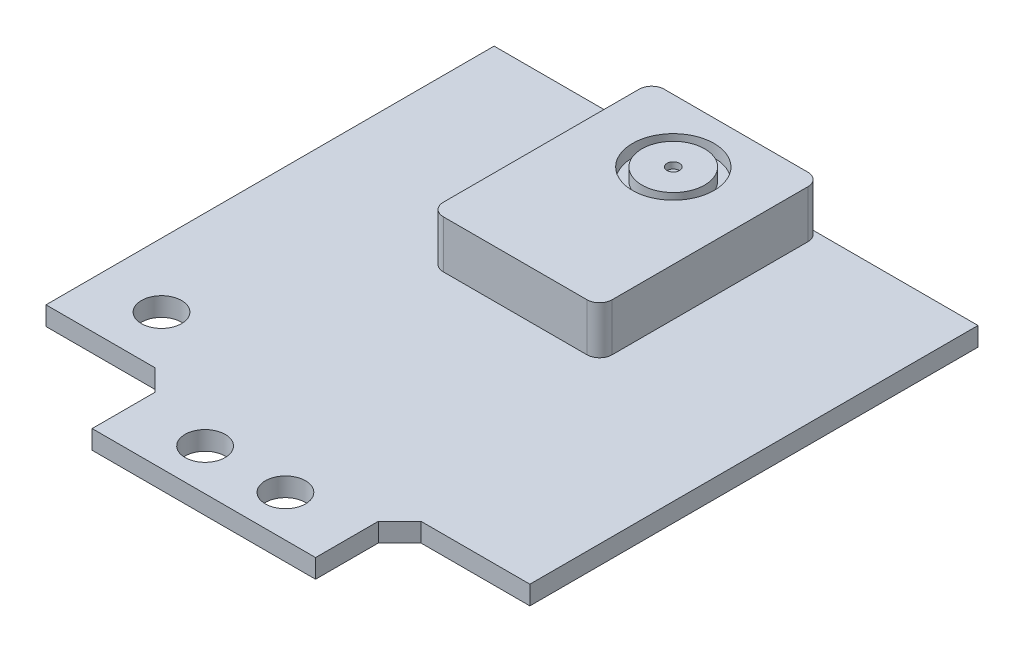
ISO-10303-21;
HEADER;
FILE_DESCRIPTION(('STEP AP214'),'2;1');
FILE_NAME('part.step','',(''),(''),'','','');
FILE_SCHEMA(('AUTOMOTIVE_DESIGN { 1 0 10303 214 1 1 1 1 }'));
ENDSEC;
DATA;
#1=APPLICATION_CONTEXT('core data for automotive mechanical design processes');
#2=APPLICATION_PROTOCOL_DEFINITION('international standard','automotive_design',2000,#1);
#3=PRODUCT_CONTEXT('',#1,'mechanical');
#4=PRODUCT('Part','Part','',(#3));
#5=PRODUCT_RELATED_PRODUCT_CATEGORY('part','',(#4));
#6=PRODUCT_DEFINITION_FORMATION('','',#4);
#7=PRODUCT_DEFINITION_CONTEXT('part definition',#1,'design');
#8=PRODUCT_DEFINITION('design','',#6,#7);
#9=PRODUCT_DEFINITION_SHAPE('','',#8);
#10=(LENGTH_UNIT() NAMED_UNIT(*) SI_UNIT(.MILLI.,.METRE.));
#11=(NAMED_UNIT(*) PLANE_ANGLE_UNIT() SI_UNIT($,.RADIAN.));
#12=(NAMED_UNIT(*) SI_UNIT($,.STERADIAN.) SOLID_ANGLE_UNIT());
#13=UNCERTAINTY_MEASURE_WITH_UNIT(LENGTH_MEASURE(1.E-05),#10,'distance_accuracy_value','');
#14=(GEOMETRIC_REPRESENTATION_CONTEXT(3) GLOBAL_UNCERTAINTY_ASSIGNED_CONTEXT((#13)) GLOBAL_UNIT_ASSIGNED_CONTEXT((#10,
#11,#12)) REPRESENTATION_CONTEXT('',''));
#15=CARTESIAN_POINT('',(0.,0.,0.));
#16=DIRECTION('',(0.,0.,1.));
#17=DIRECTION('',(1.,0.,0.));
#18=AXIS2_PLACEMENT_3D('',#15,#16,#17);
#19=CARTESIAN_POINT('',(6.725,5.3,0.));
#20=DIRECTION('',(-1.,0.,0.));
#21=DIRECTION('',(0.,0.,1.));
#22=AXIS2_PLACEMENT_3D('',#19,#20,#21);
#23=PLANE('',#22);
#24=DIRECTION('',(0.,0.,-1.));
#25=VECTOR('',#24,1.);
#26=CARTESIAN_POINT('',(6.725,1.5,0.));
#27=LINE('',#26,#25);
#28=CARTESIAN_POINT('',(6.725,1.5,-1.25));
#29=VERTEX_POINT('',#28);
#30=CARTESIAN_POINT('',(6.725,1.5,-16.85));
#31=VERTEX_POINT('',#30);
#32=EDGE_CURVE('E246',#29,#31,#27,.T.);
#33=ORIENTED_EDGE('',*,*,#32,.T.);
#34=DIRECTION('',(0.,-1.,0.));
#35=VECTOR('',#34,1.);
#36=CARTESIAN_POINT('',(6.725,5.3,-16.85));
#37=LINE('',#36,#35);
#38=CARTESIAN_POINT('',(6.725,5.3,-16.85));
#39=VERTEX_POINT('',#38);
#40=EDGE_CURVE('E13',#39,#31,#37,.T.);
#41=ORIENTED_EDGE('',*,*,#40,.F.);
#42=DIRECTION('',(0.,0.,-1.));
#43=VECTOR('',#42,1.);
#44=CARTESIAN_POINT('',(6.725,5.3,0.));
#45=LINE('',#44,#43);
#46=CARTESIAN_POINT('',(6.725,5.3,-1.25));
#47=VERTEX_POINT('',#46);
#48=EDGE_CURVE('E204',#47,#39,#45,.T.);
#49=ORIENTED_EDGE('',*,*,#48,.F.);
#50=DIRECTION('',(0.,-1.,0.));
#51=VECTOR('',#50,1.);
#52=CARTESIAN_POINT('',(6.725,5.3,-1.25));
#53=LINE('',#52,#51);
#54=EDGE_CURVE('E167',#47,#29,#53,.T.);
#55=ORIENTED_EDGE('',*,*,#54,.T.);
#56=EDGE_LOOP('',(#33,#41,#49,#55));
#57=FACE_BOUND('',#56,.T.);
#58=ADVANCED_FACE('F151',(#57),#23,.F.);
#59=CARTESIAN_POINT('',(5.725,5.3,-16.85));
#60=DIRECTION('',(0.,-1.,0.));
#61=DIRECTION('',(0.,0.,-1.));
#62=AXIS2_PLACEMENT_3D('',#59,#60,#61);
#63=CYLINDRICAL_SURFACE('',#62,1.);
#64=CARTESIAN_POINT('',(5.725,1.5,-16.85));
#65=DIRECTION('',(0.,-1.,0.));
#66=DIRECTION('',(0.,0.,-1.));
#67=AXIS2_PLACEMENT_3D('',#64,#65,#66);
#68=CIRCLE('',#67,1.);
#69=CARTESIAN_POINT('',(5.725,1.5,-17.85));
#70=VERTEX_POINT('',#69);
#71=EDGE_CURVE('E248',#70,#31,#68,.T.);
#72=ORIENTED_EDGE('',*,*,#71,.F.);
#73=DIRECTION('',(0.,-1.,0.));
#74=VECTOR('',#73,1.);
#75=CARTESIAN_POINT('',(5.725,5.3,-17.85));
#76=LINE('',#75,#74);
#77=CARTESIAN_POINT('',(5.725,5.3,-17.85));
#78=VERTEX_POINT('',#77);
#79=EDGE_CURVE('E159',#78,#70,#76,.T.);
#80=ORIENTED_EDGE('',*,*,#79,.F.);
#81=CARTESIAN_POINT('',(5.725,5.3,-16.85));
#82=DIRECTION('',(0.,-1.,0.));
#83=DIRECTION('',(0.,0.,-1.));
#84=AXIS2_PLACEMENT_3D('',#81,#82,#83);
#85=CIRCLE('',#84,1.);
#86=EDGE_CURVE('E286',#78,#39,#85,.T.);
#87=ORIENTED_EDGE('',*,*,#86,.T.);
#88=ORIENTED_EDGE('',*,*,#40,.T.);
#89=EDGE_LOOP('',(#72,#80,#87,#88));
#90=FACE_BOUND('',#89,.T.);
#91=ADVANCED_FACE('F285',(#90),#63,.T.);
#92=CARTESIAN_POINT('',(0.,5.3,-17.85));
#93=DIRECTION('',(0.,0.,1.));
#94=DIRECTION('',(1.,0.,0.));
#95=AXIS2_PLACEMENT_3D('',#92,#93,#94);
#96=PLANE('',#95);
#97=DIRECTION('',(-1.,0.,0.));
#98=VECTOR('',#97,1.);
#99=CARTESIAN_POINT('',(0.,1.5,-17.85));
#100=LINE('',#99,#98);
#101=CARTESIAN_POINT('',(-5.725,1.5,-17.85));
#102=VERTEX_POINT('',#101);
#103=EDGE_CURVE('E252',#70,#102,#100,.T.);
#104=ORIENTED_EDGE('',*,*,#103,.T.);
#105=DIRECTION('',(0.,-1.,0.));
#106=VECTOR('',#105,1.);
#107=CARTESIAN_POINT('',(-5.725,5.3,-17.85));
#108=LINE('',#107,#106);
#109=CARTESIAN_POINT('',(-5.725,5.3,-17.85));
#110=VERTEX_POINT('',#109);
#111=EDGE_CURVE('E272',#110,#102,#108,.T.);
#112=ORIENTED_EDGE('',*,*,#111,.F.);
#113=DIRECTION('',(-1.,0.,0.));
#114=VECTOR('',#113,1.);
#115=CARTESIAN_POINT('',(0.,5.3,-17.85));
#116=LINE('',#115,#114);
#117=EDGE_CURVE('E278',#78,#110,#116,.T.);
#118=ORIENTED_EDGE('',*,*,#117,.F.);
#119=ORIENTED_EDGE('',*,*,#79,.T.);
#120=EDGE_LOOP('',(#104,#112,#118,#119));
#121=FACE_BOUND('',#120,.T.);
#122=ADVANCED_FACE('F276',(#121),#96,.F.);
#123=CARTESIAN_POINT('',(-5.725,5.3,-16.85));
#124=DIRECTION('',(0.,-1.,0.));
#125=DIRECTION('',(0.,0.,-1.));
#126=AXIS2_PLACEMENT_3D('',#123,#124,#125);
#127=CYLINDRICAL_SURFACE('',#126,1.);
#128=CARTESIAN_POINT('',(-5.725,1.5,-16.85));
#129=DIRECTION('',(0.,-1.,0.));
#130=DIRECTION('',(0.,0.,-1.));
#131=AXIS2_PLACEMENT_3D('',#128,#129,#130);
#132=CIRCLE('',#131,1.);
#133=CARTESIAN_POINT('',(-6.725,1.5,-16.85));
#134=VERTEX_POINT('',#133);
#135=EDGE_CURVE('E255',#134,#102,#132,.T.);
#136=ORIENTED_EDGE('',*,*,#135,.F.);
#137=DIRECTION('',(0.,-1.,0.));
#138=VECTOR('',#137,1.);
#139=CARTESIAN_POINT('',(-6.725,5.3,-16.85));
#140=LINE('',#139,#138);
#141=CARTESIAN_POINT('',(-6.725,5.3,-16.85));
#142=VERTEX_POINT('',#141);
#143=EDGE_CURVE('E270',#142,#134,#140,.T.);
#144=ORIENTED_EDGE('',*,*,#143,.F.);
#145=CARTESIAN_POINT('',(-5.725,5.3,-16.85));
#146=DIRECTION('',(0.,-1.,0.));
#147=DIRECTION('',(0.,0.,-1.));
#148=AXIS2_PLACEMENT_3D('',#145,#146,#147);
#149=CIRCLE('',#148,1.);
#150=EDGE_CURVE('E429',#142,#110,#149,.T.);
#151=ORIENTED_EDGE('',*,*,#150,.T.);
#152=ORIENTED_EDGE('',*,*,#111,.T.);
#153=EDGE_LOOP('',(#136,#144,#151,#152));
#154=FACE_BOUND('',#153,.T.);
#155=ADVANCED_FACE('F306',(#154),#127,.T.);
#156=CARTESIAN_POINT('',(-6.725,5.3,0.));
#157=DIRECTION('',(-1.,0.,0.));
#158=DIRECTION('',(0.,0.,1.));
#159=AXIS2_PLACEMENT_3D('',#156,#157,#158);
#160=PLANE('',#159);
#161=DIRECTION('',(0.,0.,-1.));
#162=VECTOR('',#161,1.);
#163=CARTESIAN_POINT('',(-6.725,1.5,0.));
#164=LINE('',#163,#162);
#165=CARTESIAN_POINT('',(-6.725,1.5,-1.25));
#166=VERTEX_POINT('',#165);
#167=EDGE_CURVE('E258',#166,#134,#164,.T.);
#168=ORIENTED_EDGE('',*,*,#167,.F.);
#169=DIRECTION('',(0.,-1.,0.));
#170=VECTOR('',#169,1.);
#171=CARTESIAN_POINT('',(-6.725,5.3,-1.25));
#172=LINE('',#171,#170);
#173=CARTESIAN_POINT('',(-6.725,5.3,-1.25));
#174=VERTEX_POINT('',#173);
#175=EDGE_CURVE('E230',#174,#166,#172,.T.);
#176=ORIENTED_EDGE('',*,*,#175,.F.);
#177=DIRECTION('',(0.,0.,-1.));
#178=VECTOR('',#177,1.);
#179=CARTESIAN_POINT('',(-6.725,5.3,0.));
#180=LINE('',#179,#178);
#181=EDGE_CURVE('E238',#174,#142,#180,.T.);
#182=ORIENTED_EDGE('',*,*,#181,.T.);
#183=ORIENTED_EDGE('',*,*,#143,.T.);
#184=EDGE_LOOP('',(#168,#176,#182,#183));
#185=FACE_BOUND('',#184,.T.);
#186=ADVANCED_FACE('F311',(#185),#160,.T.);
#187=CARTESIAN_POINT('',(-5.725,5.3,-1.25));
#188=DIRECTION('',(0.,-1.,0.));
#189=DIRECTION('',(0.,0.,-1.));
#190=AXIS2_PLACEMENT_3D('',#187,#188,#189);
#191=CYLINDRICAL_SURFACE('',#190,1.);
#192=CARTESIAN_POINT('',(-5.725,1.5,-1.25));
#193=DIRECTION('',(0.,-1.,0.));
#194=DIRECTION('',(0.,0.,-1.));
#195=AXIS2_PLACEMENT_3D('',#192,#193,#194);
#196=CIRCLE('',#195,1.);
#197=CARTESIAN_POINT('',(-5.725,1.5,-0.249999999999999));
#198=VERTEX_POINT('',#197);
#199=EDGE_CURVE('E226',#198,#166,#196,.T.);
#200=ORIENTED_EDGE('',*,*,#199,.F.);
#201=DIRECTION('',(0.,-1.,0.));
#202=VECTOR('',#201,1.);
#203=CARTESIAN_POINT('',(-5.725,5.3,-0.249999999999999));
#204=LINE('',#203,#202);
#205=CARTESIAN_POINT('',(-5.725,5.3,-0.249999999999999));
#206=VERTEX_POINT('',#205);
#207=EDGE_CURVE('E221',#206,#198,#204,.T.);
#208=ORIENTED_EDGE('',*,*,#207,.F.);
#209=CARTESIAN_POINT('',(-5.725,5.3,-1.25));
#210=DIRECTION('',(0.,-1.,0.));
#211=DIRECTION('',(0.,0.,-1.));
#212=AXIS2_PLACEMENT_3D('',#209,#210,#211);
#213=CIRCLE('',#212,1.);
#214=EDGE_CURVE('E224',#206,#174,#213,.T.);
#215=ORIENTED_EDGE('',*,*,#214,.T.);
#216=ORIENTED_EDGE('',*,*,#175,.T.);
#217=EDGE_LOOP('',(#200,#208,#215,#216));
#218=FACE_BOUND('',#217,.T.);
#219=ADVANCED_FACE('F223',(#218),#191,.T.);
#220=CARTESIAN_POINT('',(0.,5.3,-0.249999999999999));
#221=DIRECTION('',(0.,0.,1.));
#222=DIRECTION('',(1.,0.,0.));
#223=AXIS2_PLACEMENT_3D('',#220,#221,#222);
#224=PLANE('',#223);
#225=DIRECTION('',(-1.,0.,0.));
#226=VECTOR('',#225,1.);
#227=CARTESIAN_POINT('',(0.,1.5,-0.249999999999999));
#228=LINE('',#227,#226);
#229=CARTESIAN_POINT('',(5.725,1.5,-0.25));
#230=VERTEX_POINT('',#229);
#231=EDGE_CURVE('E262',#230,#198,#228,.T.);
#232=ORIENTED_EDGE('',*,*,#231,.F.);
#233=DIRECTION('',(0.,-1.,0.));
#234=VECTOR('',#233,1.);
#235=CARTESIAN_POINT('',(5.725,5.3,-0.25));
#236=LINE('',#235,#234);
#237=CARTESIAN_POINT('',(5.725,5.3,-0.25));
#238=VERTEX_POINT('',#237);
#239=EDGE_CURVE('E192',#238,#230,#236,.T.);
#240=ORIENTED_EDGE('',*,*,#239,.F.);
#241=DIRECTION('',(-1.,0.,0.));
#242=VECTOR('',#241,1.);
#243=CARTESIAN_POINT('',(0.,5.3,-0.249999999999999));
#244=LINE('',#243,#242);
#245=EDGE_CURVE('E235',#238,#206,#244,.T.);
#246=ORIENTED_EDGE('',*,*,#245,.T.);
#247=ORIENTED_EDGE('',*,*,#207,.T.);
#248=EDGE_LOOP('',(#232,#240,#246,#247));
#249=FACE_BOUND('',#248,.T.);
#250=ADVANCED_FACE('F240',(#249),#224,.T.);
#251=CARTESIAN_POINT('',(5.725,5.3,-1.25));
#252=DIRECTION('',(0.,-1.,0.));
#253=DIRECTION('',(0.,0.,-1.));
#254=AXIS2_PLACEMENT_3D('',#251,#252,#253);
#255=CYLINDRICAL_SURFACE('',#254,1.);
#256=CARTESIAN_POINT('',(5.725,1.5,-1.25));
#257=DIRECTION('',(0.,-1.,0.));
#258=DIRECTION('',(0.,0.,-1.));
#259=AXIS2_PLACEMENT_3D('',#256,#257,#258);
#260=CIRCLE('',#259,1.);
#261=EDGE_CURVE('E264',#29,#230,#260,.T.);
#262=ORIENTED_EDGE('',*,*,#261,.F.);
#263=ORIENTED_EDGE('',*,*,#54,.F.);
#264=CARTESIAN_POINT('',(5.725,5.3,-1.25));
#265=DIRECTION('',(0.,-1.,0.));
#266=DIRECTION('',(0.,0.,-1.));
#267=AXIS2_PLACEMENT_3D('',#264,#265,#266);
#268=CIRCLE('',#267,1.);
#269=EDGE_CURVE('E241',#47,#238,#268,.T.);
#270=ORIENTED_EDGE('',*,*,#269,.T.);
#271=ORIENTED_EDGE('',*,*,#239,.T.);
#272=EDGE_LOOP('',(#262,#263,#270,#271));
#273=FACE_BOUND('',#272,.T.);
#274=ADVANCED_FACE('F287',(#273),#255,.T.);
#275=CARTESIAN_POINT('',(5.725,5.3,-16.85));
#276=DIRECTION('',(0.,-1.,0.));
#277=DIRECTION('',(0.,0.,-1.));
#278=AXIS2_PLACEMENT_3D('',#275,#276,#277);
#279=PLANE('',#278);
#280=CARTESIAN_POINT('',(0.,5.3,-12.85));
#281=DIRECTION('',(0.,-1.,0.));
#282=DIRECTION('',(0.,0.,-1.));
#283=AXIS2_PLACEMENT_3D('',#280,#281,#282);
#284=CIRCLE('',#283,3.25);
#285=CARTESIAN_POINT('',(0.,5.3,-16.1));
#286=VERTEX_POINT('',#285);
#287=EDGE_CURVE('E420',#286,#286,#284,.T.);
#288=ORIENTED_EDGE('',*,*,#287,.T.);
#289=EDGE_LOOP('',(#288));
#290=FACE_BOUND('',#289,.T.);
#291=ORIENTED_EDGE('',*,*,#48,.T.);
#292=ORIENTED_EDGE('',*,*,#86,.F.);
#293=ORIENTED_EDGE('',*,*,#117,.T.);
#294=ORIENTED_EDGE('',*,*,#150,.F.);
#295=ORIENTED_EDGE('',*,*,#181,.F.);
#296=ORIENTED_EDGE('',*,*,#214,.F.);
#297=ORIENTED_EDGE('',*,*,#245,.F.);
#298=ORIENTED_EDGE('',*,*,#269,.F.);
#299=EDGE_LOOP('',(#291,#292,#293,#294,#295,#296,#297,#298));
#300=FACE_BOUND('',#299,.T.);
#301=ADVANCED_FACE('F234',(#290,#300),#279,.F.);
#302=CARTESIAN_POINT('',(5.725,1.5,-16.85));
#303=DIRECTION('',(0.,-1.,0.));
#304=DIRECTION('',(0.,0.,-1.));
#305=AXIS2_PLACEMENT_3D('',#302,#303,#304);
#306=PLANE('',#305);
#307=ORIENTED_EDGE('',*,*,#32,.F.);
#308=ORIENTED_EDGE('',*,*,#261,.T.);
#309=ORIENTED_EDGE('',*,*,#231,.T.);
#310=ORIENTED_EDGE('',*,*,#199,.T.);
#311=ORIENTED_EDGE('',*,*,#167,.T.);
#312=ORIENTED_EDGE('',*,*,#135,.T.);
#313=ORIENTED_EDGE('',*,*,#103,.F.);
#314=ORIENTED_EDGE('',*,*,#71,.T.);
#315=EDGE_LOOP('',(#307,#308,#309,#310,#311,#312,#313,#314));
#316=FACE_BOUND('',#315,.T.);
#317=ADVANCED_FACE('F283',(#316),#306,.T.);
#318=CARTESIAN_POINT('',(0.,4.3,-12.85));
#319=DIRECTION('',(0.,-1.,0.));
#320=DIRECTION('',(0.,0.,-1.));
#321=AXIS2_PLACEMENT_3D('',#318,#319,#320);
#322=PLANE('',#321);
#323=CARTESIAN_POINT('',(0.,4.3,-12.85));
#324=DIRECTION('',(0.,-1.,0.));
#325=DIRECTION('',(0.,0.,-1.));
#326=AXIS2_PLACEMENT_3D('',#323,#324,#325);
#327=CIRCLE('',#326,3.25);
#328=CARTESIAN_POINT('',(0.,4.3,-16.1));
#329=VERTEX_POINT('',#328);
#330=EDGE_CURVE('E249',#329,#329,#327,.T.);
#331=ORIENTED_EDGE('',*,*,#330,.F.);
#332=EDGE_LOOP('',(#331));
#333=FACE_BOUND('',#332,.T.);
#334=CARTESIAN_POINT('',(0.,4.3,-12.85));
#335=DIRECTION('',(0.,-1.,0.));
#336=DIRECTION('',(0.,0.,-1.));
#337=AXIS2_PLACEMENT_3D('',#334,#335,#336);
#338=CIRCLE('',#337,2.5);
#339=CARTESIAN_POINT('',(0.,4.3,-15.35));
#340=VERTEX_POINT('',#339);
#341=EDGE_CURVE('E414',#340,#340,#338,.T.);
#342=ORIENTED_EDGE('',*,*,#341,.T.);
#343=EDGE_LOOP('',(#342));
#344=FACE_BOUND('',#343,.T.);
#345=ADVANCED_FACE('F339',(#333,#344),#322,.F.);
#346=CARTESIAN_POINT('',(0.,4.3,-12.85));
#347=DIRECTION('',(0.,1.,0.));
#348=DIRECTION('',(0.,0.,1.));
#349=AXIS2_PLACEMENT_3D('',#346,#347,#348);
#350=CYLINDRICAL_SURFACE('',#349,3.25);
#351=ORIENTED_EDGE('',*,*,#330,.T.);
#352=EDGE_LOOP('',(#351));
#353=FACE_BOUND('',#352,.T.);
#354=ORIENTED_EDGE('',*,*,#287,.F.);
#355=EDGE_LOOP('',(#354));
#356=FACE_BOUND('',#355,.T.);
#357=ADVANCED_FACE('F355',(#353,#356),#350,.F.);
#358=CARTESIAN_POINT('',(0.,4.3,-12.85));
#359=DIRECTION('',(0.,1.,0.));
#360=DIRECTION('',(0.,0.,1.));
#361=AXIS2_PLACEMENT_3D('',#358,#359,#360);
#362=CYLINDRICAL_SURFACE('',#361,2.5);
#363=ORIENTED_EDGE('',*,*,#341,.F.);
#364=EDGE_LOOP('',(#363));
#365=FACE_BOUND('',#364,.T.);
#366=CARTESIAN_POINT('',(0.,5.3,-12.85));
#367=DIRECTION('',(0.,-1.,0.));
#368=DIRECTION('',(0.,0.,-1.));
#369=AXIS2_PLACEMENT_3D('',#366,#367,#368);
#370=CIRCLE('',#369,2.5);
#371=CARTESIAN_POINT('',(0.,5.3,-15.35));
#372=VERTEX_POINT('',#371);
#373=EDGE_CURVE('E410',#372,#372,#370,.T.);
#374=ORIENTED_EDGE('',*,*,#373,.T.);
#375=EDGE_LOOP('',(#374));
#376=FACE_BOUND('',#375,.T.);
#377=ADVANCED_FACE('F365',(#365,#376),#362,.T.);
#378=CARTESIAN_POINT('',(0.,5.3,-12.85));
#379=DIRECTION('',(0.,1.,0.));
#380=DIRECTION('',(0.,0.,1.));
#381=AXIS2_PLACEMENT_3D('',#378,#379,#380);
#382=CIRCLE('',#381,0.5);
#383=CARTESIAN_POINT('',(0.,5.3,-12.35));
#384=VERTEX_POINT('',#383);
#385=EDGE_CURVE('E411',#384,#384,#382,.T.);
#386=ORIENTED_EDGE('',*,*,#385,.F.);
#387=EDGE_LOOP('',(#386));
#388=FACE_BOUND('',#387,.T.);
#389=ORIENTED_EDGE('',*,*,#373,.F.);
#390=EDGE_LOOP('',(#389));
#391=FACE_BOUND('',#390,.T.);
#392=ADVANCED_FACE('F296',(#388,#391),#279,.F.);
#393=CARTESIAN_POINT('',(0.,4.8,-12.85));
#394=DIRECTION('',(0.,1.,0.));
#395=DIRECTION('',(0.,0.,1.));
#396=AXIS2_PLACEMENT_3D('',#393,#394,#395);
#397=CYLINDRICAL_SURFACE('',#396,0.5);
#398=CARTESIAN_POINT('',(0.,4.8,-12.85));
#399=DIRECTION('',(0.,1.,0.));
#400=DIRECTION('',(0.,0.,1.));
#401=AXIS2_PLACEMENT_3D('',#398,#399,#400);
#402=CIRCLE('',#401,0.5);
#403=CARTESIAN_POINT('',(0.,4.8,-12.35));
#404=VERTEX_POINT('',#403);
#405=EDGE_CURVE('E409',#404,#404,#402,.T.);
#406=ORIENTED_EDGE('',*,*,#405,.F.);
#407=EDGE_LOOP('',(#406));
#408=FACE_BOUND('',#407,.T.);
#409=ORIENTED_EDGE('',*,*,#385,.T.);
#410=EDGE_LOOP('',(#409));
#411=FACE_BOUND('',#410,.T.);
#412=ADVANCED_FACE('F385',(#408,#411),#397,.F.);
#413=CARTESIAN_POINT('',(0.,4.8,-12.85));
#414=DIRECTION('',(0.,1.,0.));
#415=DIRECTION('',(0.,0.,1.));
#416=AXIS2_PLACEMENT_3D('',#413,#414,#415);
#417=PLANE('',#416);
#418=ORIENTED_EDGE('',*,*,#405,.T.);
#419=EDGE_LOOP('',(#418));
#420=FACE_BOUND('',#419,.T.);
#421=ADVANCED_FACE('F393',(#420),#417,.T.);
#422=CLOSED_SHELL('',(#58,#91,#122,#155,#186,#219,#250,#274,#301,#317,#345,#357,#377,#392,#412,#421));
#423=MANIFOLD_SOLID_BREP('B2',#422);
#424=CARTESIAN_POINT('',(0.,1.50000000000008,0.));
#425=DIRECTION('',(0.,-1.00000000000003,0.));
#426=DIRECTION('',(0.,0.,-1.00000000000003));
#427=AXIS2_PLACEMENT_3D('',#424,#425,#426);
#428=PLANE('',#427);
#429=CARTESIAN_POINT('',(3.2,1.50000000000007,21.2500000000005));
#430=DIRECTION('',(0.,1.00000000000003,0.));
#431=DIRECTION('',(0.,0.,1.00000000000003));
#432=AXIS2_PLACEMENT_3D('',#429,#430,#431);
#433=CIRCLE('',#432,1.6);
#434=CARTESIAN_POINT('',(3.2,1.50000000000007,22.8500000000005));
#435=VERTEX_POINT('',#434);
#436=EDGE_CURVE('E671',#435,#435,#433,.F.);
#437=ORIENTED_EDGE('',*,*,#436,.T.);
#438=EDGE_LOOP('',(#437));
#439=FACE_BOUND('',#438,.T.);
#440=DIRECTION('',(1.,0.,0.));
#441=VECTOR('',#440,1.);
#442=CARTESIAN_POINT('',(-19.2750000000002,1.50000000000016,-17.8500000000006));
#443=LINE('',#442,#441);
#444=CARTESIAN_POINT('',(-19.2750000000002,1.50000000000016,-17.8500000000006));
#445=VERTEX_POINT('',#444);
#446=CARTESIAN_POINT('',(19.2749999999998,1.50000000000007,-17.8500000000004));
#447=VERTEX_POINT('',#446);
#448=EDGE_CURVE('E617',#445,#447,#443,.T.);
#449=ORIENTED_EDGE('',*,*,#448,.F.);
#450=DIRECTION('',(0.,0.,1.00000000000003));
#451=VECTOR('',#450,1.);
#452=CARTESIAN_POINT('',(-19.2750000000002,1.50000000000016,-17.8500000000006));
#453=LINE('',#452,#451);
#454=CARTESIAN_POINT('',(-19.275,1.50000000000007,17.8500000000002));
#455=VERTEX_POINT('',#454);
#456=EDGE_CURVE('E571',#445,#455,#453,.T.);
#457=ORIENTED_EDGE('',*,*,#456,.T.);
#458=DIRECTION('',(1.,0.,0.));
#459=VECTOR('',#458,1.);
#460=CARTESIAN_POINT('',(-19.275,1.50000000000007,17.8500000000002));
#461=LINE('',#460,#459);
#462=CARTESIAN_POINT('',(-10.6,1.50000000000013,17.8500000000004));
#463=VERTEX_POINT('',#462);
#464=EDGE_CURVE('E564',#455,#463,#461,.T.);
#465=ORIENTED_EDGE('',*,*,#464,.T.);
#466=DIRECTION('',(0.707106781186547,0.,0.707106781186565));
#467=VECTOR('',#466,1.);
#468=CARTESIAN_POINT('',(-10.6,1.50000000000013,17.8500000000004));
#469=LINE('',#468,#467);
#470=CARTESIAN_POINT('',(-8.9,1.50000000000011,19.5500000000005));
#471=VERTEX_POINT('',#470);
#472=EDGE_CURVE('E569',#463,#471,#469,.T.);
#473=ORIENTED_EDGE('',*,*,#472,.T.);
#474=DIRECTION('',(0.,0.,1.00000000000003));
#475=VECTOR('',#474,1.);
#476=CARTESIAN_POINT('',(-8.9,1.50000000000011,19.5500000000005));
#477=LINE('',#476,#475);
#478=CARTESIAN_POINT('',(-8.89999999999999,1.50000000000003,24.5500000000006));
#479=VERTEX_POINT('',#478);
#480=EDGE_CURVE('E586',#471,#479,#477,.T.);
#481=ORIENTED_EDGE('',*,*,#480,.T.);
#482=DIRECTION('',(1.,0.,0.));
#483=VECTOR('',#482,1.);
#484=CARTESIAN_POINT('',(-8.89999999999999,1.50000000000003,24.5500000000006));
#485=LINE('',#484,#483);
#486=CARTESIAN_POINT('',(8.90000000000001,1.50000000000008,24.5500000000006));
#487=VERTEX_POINT('',#486);
#488=EDGE_CURVE('E588',#479,#487,#485,.T.);
#489=ORIENTED_EDGE('',*,*,#488,.T.);
#490=DIRECTION('',(0.,0.,1.00000000000003));
#491=VECTOR('',#490,1.);
#492=CARTESIAN_POINT('',(8.90000000000001,1.50000000000014,19.5500000000004));
#493=LINE('',#492,#491);
#494=CARTESIAN_POINT('',(8.90000000000001,1.50000000000014,19.5500000000004));
#495=VERTEX_POINT('',#494);
#496=EDGE_CURVE('E645',#495,#487,#493,.T.);
#497=ORIENTED_EDGE('',*,*,#496,.F.);
#498=DIRECTION('',(-0.707106781186547,0.,0.70710678118657));
#499=VECTOR('',#498,1.);
#500=CARTESIAN_POINT('',(10.6,1.50000000000013,17.8500000000004));
#501=LINE('',#500,#499);
#502=CARTESIAN_POINT('',(10.6,1.50000000000013,17.8500000000004));
#503=VERTEX_POINT('',#502);
#504=EDGE_CURVE('E652',#503,#495,#501,.T.);
#505=ORIENTED_EDGE('',*,*,#504,.F.);
#506=DIRECTION('',(-1.,0.,0.));
#507=VECTOR('',#506,1.);
#508=CARTESIAN_POINT('',(19.275,1.5,17.8500000000001));
#509=LINE('',#508,#507);
#510=CARTESIAN_POINT('',(19.275,1.5,17.8500000000001));
#511=VERTEX_POINT('',#510);
#512=EDGE_CURVE('E654',#511,#503,#509,.T.);
#513=ORIENTED_EDGE('',*,*,#512,.F.);
#514=DIRECTION('',(0.,0.,1.00000000000003));
#515=VECTOR('',#514,1.);
#516=CARTESIAN_POINT('',(19.2749999999998,1.50000000000007,-17.8500000000004));
#517=LINE('',#516,#515);
#518=EDGE_CURVE('E659',#447,#511,#517,.T.);
#519=ORIENTED_EDGE('',*,*,#518,.F.);
#520=EDGE_LOOP('',(#449,#457,#465,#473,#481,#489,#497,#505,#513,#519));
#521=FACE_BOUND('',#520,.T.);
#522=CARTESIAN_POINT('',(-14.1749999999999,1.50000000000004,13.7500000000001));
#523=DIRECTION('',(0.,1.00000000000003,0.));
#524=DIRECTION('',(0.,0.,1.00000000000003));
#525=AXIS2_PLACEMENT_3D('',#522,#523,#524);
#526=CIRCLE('',#525,1.6);
#527=CARTESIAN_POINT('',(-14.1749999999999,1.50000000000004,15.3500000000002));
#528=VERTEX_POINT('',#527);
#529=EDGE_CURVE('E597',#528,#528,#526,.T.);
#530=ORIENTED_EDGE('',*,*,#529,.F.);
#531=EDGE_LOOP('',(#530));
#532=FACE_BOUND('',#531,.T.);
#533=CARTESIAN_POINT('',(-3.20000000000001,1.50000000000014,21.2500000000004));
#534=DIRECTION('',(0.,1.00000000000003,0.));
#535=DIRECTION('',(0.,0.,1.00000000000003));
#536=AXIS2_PLACEMENT_3D('',#533,#534,#535);
#537=CIRCLE('',#536,1.6);
#538=CARTESIAN_POINT('',(-3.20000000000001,1.50000000000014,22.8500000000004));
#539=VERTEX_POINT('',#538);
#540=EDGE_CURVE('E665',#539,#539,#537,.T.);
#541=ORIENTED_EDGE('',*,*,#540,.F.);
#542=EDGE_LOOP('',(#541));
#543=FACE_BOUND('',#542,.T.);
#544=ADVANCED_FACE('F482',(#439,#521,#532,#543),#428,.F.);
#545=CARTESIAN_POINT('',(0.,0.,0.));
#546=DIRECTION('',(0.,-1.00000000000003,0.));
#547=DIRECTION('',(0.,0.,-1.00000000000003));
#548=AXIS2_PLACEMENT_3D('',#545,#546,#547);
#549=PLANE('',#548);
#550=CARTESIAN_POINT('',(3.20000000000001,0.,21.2500000000006));
#551=DIRECTION('',(0.,1.00000000000003,0.));
#552=DIRECTION('',(0.,0.,1.00000000000003));
#553=AXIS2_PLACEMENT_3D('',#550,#551,#552);
#554=CIRCLE('',#553,1.6);
#555=CARTESIAN_POINT('',(3.20000000000001,0.,22.8500000000006));
#556=VERTEX_POINT('',#555);
#557=EDGE_CURVE('E674',#556,#556,#554,.F.);
#558=ORIENTED_EDGE('',*,*,#557,.F.);
#559=EDGE_LOOP('',(#558));
#560=FACE_BOUND('',#559,.T.);
#561=CARTESIAN_POINT('',(-14.1749999999999,0.,13.7500000000003));
#562=DIRECTION('',(0.,1.00000000000003,0.));
#563=DIRECTION('',(0.,0.,1.00000000000003));
#564=AXIS2_PLACEMENT_3D('',#561,#562,#563);
#565=CIRCLE('',#564,1.6);
#566=CARTESIAN_POINT('',(-14.1749999999999,0.,15.3500000000003));
#567=VERTEX_POINT('',#566);
#568=EDGE_CURVE('E662',#567,#567,#565,.T.);
#569=ORIENTED_EDGE('',*,*,#568,.T.);
#570=EDGE_LOOP('',(#569));
#571=FACE_BOUND('',#570,.T.);
#572=DIRECTION('',(1.,0.,0.));
#573=VECTOR('',#572,1.);
#574=CARTESIAN_POINT('',(-19.2750000000001,1.38777878078145E-13,-17.8500000000006));
#575=LINE('',#574,#573);
#576=CARTESIAN_POINT('',(-19.2750000000001,1.38777878078145E-13,-17.8500000000006));
#577=VERTEX_POINT('',#576);
#578=CARTESIAN_POINT('',(19.2749999999999,0.,-17.8500000000004));
#579=VERTEX_POINT('',#578);
#580=EDGE_CURVE('E593',#577,#579,#575,.T.);
#581=ORIENTED_EDGE('',*,*,#580,.T.);
#582=DIRECTION('',(0.,0.,1.00000000000003));
#583=VECTOR('',#582,1.);
#584=CARTESIAN_POINT('',(19.2749999999999,0.,-17.8500000000004));
#585=LINE('',#584,#583);
#586=CARTESIAN_POINT('',(19.275,0.,17.8500000000004));
#587=VERTEX_POINT('',#586);
#588=EDGE_CURVE('E596',#579,#587,#585,.T.);
#589=ORIENTED_EDGE('',*,*,#588,.T.);
#590=DIRECTION('',(-1.,0.,0.));
#591=VECTOR('',#590,1.);
#592=CARTESIAN_POINT('',(19.275,0.,17.8500000000004));
#593=LINE('',#592,#591);
#594=CARTESIAN_POINT('',(10.6,1.45716771982052E-13,17.8500000000003));
#595=VERTEX_POINT('',#594);
#596=EDGE_CURVE('E600',#587,#595,#593,.T.);
#597=ORIENTED_EDGE('',*,*,#596,.T.);
#598=DIRECTION('',(-0.707106781186547,0.,0.70710678118657));
#599=VECTOR('',#598,1.);
#600=CARTESIAN_POINT('',(10.6,1.45716771982052E-13,17.8500000000003));
#601=LINE('',#600,#599);
#602=CARTESIAN_POINT('',(8.90000000000001,0.,19.5500000000006));
#603=VERTEX_POINT('',#602);
#604=EDGE_CURVE('E603',#595,#603,#601,.T.);
#605=ORIENTED_EDGE('',*,*,#604,.T.);
#606=DIRECTION('',(0.,0.,1.00000000000003));
#607=VECTOR('',#606,1.);
#608=CARTESIAN_POINT('',(8.90000000000001,0.,19.5500000000006));
#609=LINE('',#608,#607);
#610=CARTESIAN_POINT('',(8.90000000000001,0.,24.5500000000006));
#611=VERTEX_POINT('',#610);
#612=EDGE_CURVE('E606',#603,#611,#609,.T.);
#613=ORIENTED_EDGE('',*,*,#612,.T.);
#614=DIRECTION('',(1.,0.,0.));
#615=VECTOR('',#614,1.);
#616=CARTESIAN_POINT('',(-8.89999999999999,0.,24.5500000000006));
#617=LINE('',#616,#615);
#618=CARTESIAN_POINT('',(-8.89999999999999,0.,24.5500000000006));
#619=VERTEX_POINT('',#618);
#620=EDGE_CURVE('E609',#619,#611,#617,.T.);
#621=ORIENTED_EDGE('',*,*,#620,.F.);
#622=DIRECTION('',(0.,0.,1.00000000000003));
#623=VECTOR('',#622,1.);
#624=CARTESIAN_POINT('',(-8.9,0.,19.5500000000005));
#625=LINE('',#624,#623);
#626=CARTESIAN_POINT('',(-8.9,0.,19.5500000000005));
#627=VERTEX_POINT('',#626);
#628=EDGE_CURVE('E612',#627,#619,#625,.T.);
#629=ORIENTED_EDGE('',*,*,#628,.F.);
#630=DIRECTION('',(0.707106781186547,0.,0.707106781186565));
#631=VECTOR('',#630,1.);
#632=CARTESIAN_POINT('',(-10.6,0.,17.8500000000005));
#633=LINE('',#632,#631);
#634=CARTESIAN_POINT('',(-10.6,0.,17.8500000000005));
#635=VERTEX_POINT('',#634);
#636=EDGE_CURVE('E614',#635,#627,#633,.T.);
#637=ORIENTED_EDGE('',*,*,#636,.F.);
#638=DIRECTION('',(1.,0.,0.));
#639=VECTOR('',#638,1.);
#640=CARTESIAN_POINT('',(-19.275,1.59594559789866E-13,17.8500000000004));
#641=LINE('',#640,#639);
#642=CARTESIAN_POINT('',(-19.275,1.59594559789866E-13,17.8500000000004));
#643=VERTEX_POINT('',#642);
#644=EDGE_CURVE('E578',#643,#635,#641,.T.);
#645=ORIENTED_EDGE('',*,*,#644,.F.);
#646=DIRECTION('',(0.,0.,1.00000000000003));
#647=VECTOR('',#646,1.);
#648=CARTESIAN_POINT('',(-19.2750000000001,1.38777878078145E-13,-17.8500000000006));
#649=LINE('',#648,#647);
#650=EDGE_CURVE('E534',#577,#643,#649,.T.);
#651=ORIENTED_EDGE('',*,*,#650,.F.);
#652=EDGE_LOOP('',(#581,#589,#597,#605,#613,#621,#629,#637,#645,#651));
#653=FACE_BOUND('',#652,.T.);
#654=CARTESIAN_POINT('',(-3.19999999999999,0.,21.2500000000006));
#655=DIRECTION('',(0.,1.00000000000003,0.));
#656=DIRECTION('',(0.,0.,1.00000000000003));
#657=AXIS2_PLACEMENT_3D('',#654,#655,#656);
#658=CIRCLE('',#657,1.6);
#659=CARTESIAN_POINT('',(-3.19999999999999,0.,22.8500000000006));
#660=VERTEX_POINT('',#659);
#661=EDGE_CURVE('E668',#660,#660,#658,.T.);
#662=ORIENTED_EDGE('',*,*,#661,.T.);
#663=EDGE_LOOP('',(#662));
#664=FACE_BOUND('',#663,.T.);
#665=ADVANCED_FACE('F633',(#560,#571,#653,#664),#549,.T.);
#666=CARTESIAN_POINT('',(-19.2750000000002,1.50000000000016,-17.8500000000006));
#667=DIRECTION('',(0.,0.,-1.00000000000003));
#668=DIRECTION('',(-1.,0.,0.));
#669=AXIS2_PLACEMENT_3D('',#666,#667,#668);
#670=PLANE('',#669);
#671=ORIENTED_EDGE('',*,*,#580,.F.);
#672=DIRECTION('',(0.,-1.00000000000003,0.));
#673=VECTOR('',#672,1.);
#674=CARTESIAN_POINT('',(-19.2750000000002,1.50000000000016,-17.8500000000006));
#675=LINE('',#674,#673);
#676=EDGE_CURVE('E149',#445,#577,#675,.T.);
#677=ORIENTED_EDGE('',*,*,#676,.F.);
#678=ORIENTED_EDGE('',*,*,#448,.T.);
#679=DIRECTION('',(0.,-1.00000000000003,0.));
#680=VECTOR('',#679,1.);
#681=CARTESIAN_POINT('',(19.2749999999998,1.50000000000007,-17.8500000000004));
#682=LINE('',#681,#680);
#683=EDGE_CURVE('E486',#447,#579,#682,.T.);
#684=ORIENTED_EDGE('',*,*,#683,.T.);
#685=EDGE_LOOP('',(#671,#677,#678,#684));
#686=FACE_BOUND('',#685,.T.);
#687=ADVANCED_FACE('F484',(#686),#670,.T.);
#688=CARTESIAN_POINT('',(-19.2750000000002,1.50000000000016,-17.8500000000006));
#689=DIRECTION('',(1.,0.,0.));
#690=DIRECTION('',(0.,0.,-1.00000000000003));
#691=AXIS2_PLACEMENT_3D('',#688,#689,#690);
#692=PLANE('',#691);
#693=ORIENTED_EDGE('',*,*,#650,.T.);
#694=DIRECTION('',(0.,-1.00000000000003,0.));
#695=VECTOR('',#694,1.);
#696=CARTESIAN_POINT('',(-19.275,1.50000000000007,17.8500000000002));
#697=LINE('',#696,#695);
#698=EDGE_CURVE('E492',#455,#643,#697,.T.);
#699=ORIENTED_EDGE('',*,*,#698,.F.);
#700=ORIENTED_EDGE('',*,*,#456,.F.);
#701=ORIENTED_EDGE('',*,*,#676,.T.);
#702=EDGE_LOOP('',(#693,#699,#700,#701));
#703=FACE_BOUND('',#702,.T.);
#704=ADVANCED_FACE('F709',(#703),#692,.F.);
#705=CARTESIAN_POINT('',(-19.275,1.50000000000007,17.8500000000002));
#706=DIRECTION('',(0.,0.,-1.00000000000003));
#707=DIRECTION('',(-1.,0.,0.));
#708=AXIS2_PLACEMENT_3D('',#705,#706,#707);
#709=PLANE('',#708);
#710=ORIENTED_EDGE('',*,*,#644,.T.);
#711=DIRECTION('',(0.,-1.00000000000003,0.));
#712=VECTOR('',#711,1.);
#713=CARTESIAN_POINT('',(-10.6,1.50000000000013,17.8500000000004));
#714=LINE('',#713,#712);
#715=EDGE_CURVE('E575',#463,#635,#714,.T.);
#716=ORIENTED_EDGE('',*,*,#715,.F.);
#717=ORIENTED_EDGE('',*,*,#464,.F.);
#718=ORIENTED_EDGE('',*,*,#698,.T.);
#719=EDGE_LOOP('',(#710,#716,#717,#718));
#720=FACE_BOUND('',#719,.T.);
#721=ADVANCED_FACE('F576',(#720),#709,.F.);
#722=CARTESIAN_POINT('',(-10.6,1.50000000000013,17.8500000000004));
#723=DIRECTION('',(0.707106781186548,0.,-0.707106781186568));
#724=DIRECTION('',(-0.707106781186547,0.,-0.707106781186565));
#725=AXIS2_PLACEMENT_3D('',#722,#723,#724);
#726=PLANE('',#725);
#727=ORIENTED_EDGE('',*,*,#636,.T.);
#728=DIRECTION('',(0.,-1.00000000000003,0.));
#729=VECTOR('',#728,1.);
#730=CARTESIAN_POINT('',(-8.9,1.50000000000011,19.5500000000005));
#731=LINE('',#730,#729);
#732=EDGE_CURVE('E581',#471,#627,#731,.T.);
#733=ORIENTED_EDGE('',*,*,#732,.F.);
#734=ORIENTED_EDGE('',*,*,#472,.F.);
#735=ORIENTED_EDGE('',*,*,#715,.T.);
#736=EDGE_LOOP('',(#727,#733,#734,#735));
#737=FACE_BOUND('',#736,.T.);
#738=ADVANCED_FACE('F583',(#737),#726,.F.);
#739=CARTESIAN_POINT('',(-8.9,1.50000000000011,19.5500000000005));
#740=DIRECTION('',(1.,0.,0.));
#741=DIRECTION('',(0.,0.,-1.00000000000003));
#742=AXIS2_PLACEMENT_3D('',#739,#740,#741);
#743=PLANE('',#742);
#744=ORIENTED_EDGE('',*,*,#628,.T.);
#745=DIRECTION('',(0.,-1.00000000000003,0.));
#746=VECTOR('',#745,1.);
#747=CARTESIAN_POINT('',(-8.89999999999999,1.50000000000003,24.5500000000006));
#748=LINE('',#747,#746);
#749=EDGE_CURVE('E621',#479,#619,#748,.T.);
#750=ORIENTED_EDGE('',*,*,#749,.F.);
#751=ORIENTED_EDGE('',*,*,#480,.F.);
#752=ORIENTED_EDGE('',*,*,#732,.T.);
#753=EDGE_LOOP('',(#744,#750,#751,#752));
#754=FACE_BOUND('',#753,.T.);
#755=ADVANCED_FACE('F638',(#754),#743,.F.);
#756=CARTESIAN_POINT('',(-8.89999999999999,1.50000000000003,24.5500000000006));
#757=DIRECTION('',(0.,0.,-1.00000000000003));
#758=DIRECTION('',(-1.,0.,0.));
#759=AXIS2_PLACEMENT_3D('',#756,#757,#758);
#760=PLANE('',#759);
#761=ORIENTED_EDGE('',*,*,#620,.T.);
#762=DIRECTION('',(0.,-1.00000000000003,0.));
#763=VECTOR('',#762,1.);
#764=CARTESIAN_POINT('',(8.90000000000001,1.50000000000008,24.5500000000006));
#765=LINE('',#764,#763);
#766=EDGE_CURVE('E624',#487,#611,#765,.T.);
#767=ORIENTED_EDGE('',*,*,#766,.F.);
#768=ORIENTED_EDGE('',*,*,#488,.F.);
#769=ORIENTED_EDGE('',*,*,#749,.T.);
#770=EDGE_LOOP('',(#761,#767,#768,#769));
#771=FACE_BOUND('',#770,.T.);
#772=ADVANCED_FACE('F648',(#771),#760,.F.);
#773=CARTESIAN_POINT('',(8.90000000000001,1.50000000000014,19.5500000000004));
#774=DIRECTION('',(1.,0.,0.));
#775=DIRECTION('',(0.,0.,-1.00000000000003));
#776=AXIS2_PLACEMENT_3D('',#773,#774,#775);
#777=PLANE('',#776);
#778=ORIENTED_EDGE('',*,*,#612,.F.);
#779=DIRECTION('',(0.,-1.00000000000003,0.));
#780=VECTOR('',#779,1.);
#781=CARTESIAN_POINT('',(8.90000000000001,1.50000000000014,19.5500000000004));
#782=LINE('',#781,#780);
#783=EDGE_CURVE('E626',#495,#603,#782,.T.);
#784=ORIENTED_EDGE('',*,*,#783,.F.);
#785=ORIENTED_EDGE('',*,*,#496,.T.);
#786=ORIENTED_EDGE('',*,*,#766,.T.);
#787=EDGE_LOOP('',(#778,#784,#785,#786));
#788=FACE_BOUND('',#787,.T.);
#789=ADVANCED_FACE('F651',(#788),#777,.T.);
#790=CARTESIAN_POINT('',(10.6,1.50000000000013,17.8500000000004));
#791=DIRECTION('',(0.707106781186548,0.,0.707106781186566));
#792=DIRECTION('',(0.707106781186547,0.,-0.70710678118657));
#793=AXIS2_PLACEMENT_3D('',#790,#791,#792);
#794=PLANE('',#793);
#795=ORIENTED_EDGE('',*,*,#604,.F.);
#796=DIRECTION('',(0.,-1.00000000000003,0.));
#797=VECTOR('',#796,1.);
#798=CARTESIAN_POINT('',(10.6,1.50000000000013,17.8500000000004));
#799=LINE('',#798,#797);
#800=EDGE_CURVE('E628',#503,#595,#799,.T.);
#801=ORIENTED_EDGE('',*,*,#800,.F.);
#802=ORIENTED_EDGE('',*,*,#504,.T.);
#803=ORIENTED_EDGE('',*,*,#783,.T.);
#804=EDGE_LOOP('',(#795,#801,#802,#803));
#805=FACE_BOUND('',#804,.T.);
#806=ADVANCED_FACE('F722',(#805),#794,.T.);
#807=CARTESIAN_POINT('',(19.275,1.5,17.8500000000001));
#808=DIRECTION('',(0.,0.,1.00000000000003));
#809=DIRECTION('',(1.,0.,0.));
#810=AXIS2_PLACEMENT_3D('',#807,#808,#809);
#811=PLANE('',#810);
#812=ORIENTED_EDGE('',*,*,#596,.F.);
#813=DIRECTION('',(0.,-1.00000000000003,0.));
#814=VECTOR('',#813,1.);
#815=CARTESIAN_POINT('',(19.275,1.5,17.8500000000001));
#816=LINE('',#815,#814);
#817=EDGE_CURVE('E629',#511,#587,#816,.T.);
#818=ORIENTED_EDGE('',*,*,#817,.F.);
#819=ORIENTED_EDGE('',*,*,#512,.T.);
#820=ORIENTED_EDGE('',*,*,#800,.T.);
#821=EDGE_LOOP('',(#812,#818,#819,#820));
#822=FACE_BOUND('',#821,.T.);
#823=ADVANCED_FACE('F703',(#822),#811,.T.);
#824=CARTESIAN_POINT('',(19.2749999999998,1.50000000000007,-17.8500000000004));
#825=DIRECTION('',(1.,0.,0.));
#826=DIRECTION('',(0.,0.,-1.00000000000003));
#827=AXIS2_PLACEMENT_3D('',#824,#825,#826);
#828=PLANE('',#827);
#829=ORIENTED_EDGE('',*,*,#588,.F.);
#830=ORIENTED_EDGE('',*,*,#683,.F.);
#831=ORIENTED_EDGE('',*,*,#518,.T.);
#832=ORIENTED_EDGE('',*,*,#817,.T.);
#833=EDGE_LOOP('',(#829,#830,#831,#832));
#834=FACE_BOUND('',#833,.T.);
#835=ADVANCED_FACE('F631',(#834),#828,.T.);
#836=CARTESIAN_POINT('',(-14.1749999999999,1.50000000000004,13.7500000000001));
#837=DIRECTION('',(0.,-1.00000000000003,0.));
#838=DIRECTION('',(0.,0.,-1.00000000000003));
#839=AXIS2_PLACEMENT_3D('',#836,#837,#838);
#840=CYLINDRICAL_SURFACE('',#839,1.6);
#841=ORIENTED_EDGE('',*,*,#529,.T.);
#842=EDGE_LOOP('',(#841));
#843=FACE_BOUND('',#842,.T.);
#844=ORIENTED_EDGE('',*,*,#568,.F.);
#845=EDGE_LOOP('',(#844));
#846=FACE_BOUND('',#845,.T.);
#847=ADVANCED_FACE('F693',(#843,#846),#840,.F.);
#848=CARTESIAN_POINT('',(-3.20000000000001,1.50000000000014,21.2500000000004));
#849=DIRECTION('',(0.,-1.00000000000003,0.));
#850=DIRECTION('',(0.,0.,-1.00000000000003));
#851=AXIS2_PLACEMENT_3D('',#848,#849,#850);
#852=CYLINDRICAL_SURFACE('',#851,1.6);
#853=ORIENTED_EDGE('',*,*,#540,.T.);
#854=EDGE_LOOP('',(#853));
#855=FACE_BOUND('',#854,.T.);
#856=ORIENTED_EDGE('',*,*,#661,.F.);
#857=EDGE_LOOP('',(#856));
#858=FACE_BOUND('',#857,.T.);
#859=ADVANCED_FACE('F684',(#855,#858),#852,.F.);
#860=CARTESIAN_POINT('',(3.2,1.50000000000007,21.2500000000005));
#861=DIRECTION('',(0.,-1.00000000000003,0.));
#862=DIRECTION('',(0.,0.,-1.00000000000003));
#863=AXIS2_PLACEMENT_3D('',#860,#861,#862);
#864=CYLINDRICAL_SURFACE('',#863,1.6);
#865=ORIENTED_EDGE('',*,*,#436,.F.);
#866=EDGE_LOOP('',(#865));
#867=FACE_BOUND('',#866,.T.);
#868=ORIENTED_EDGE('',*,*,#557,.T.);
#869=EDGE_LOOP('',(#868));
#870=FACE_BOUND('',#869,.T.);
#871=ADVANCED_FACE('F681',(#867,#870),#864,.F.);
#872=CLOSED_SHELL('',(#544,#665,#687,#704,#721,#738,#755,#772,#789,#806,#823,#835,#847,#859,#871));
#873=MANIFOLD_SOLID_BREP('B7',#872);
#874=ADVANCED_BREP_SHAPE_REPRESENTATION('',(#18,#423,#873),#14);
#875=SHAPE_DEFINITION_REPRESENTATION(#9,#874);
ENDSEC;
END-ISO-10303-21;
